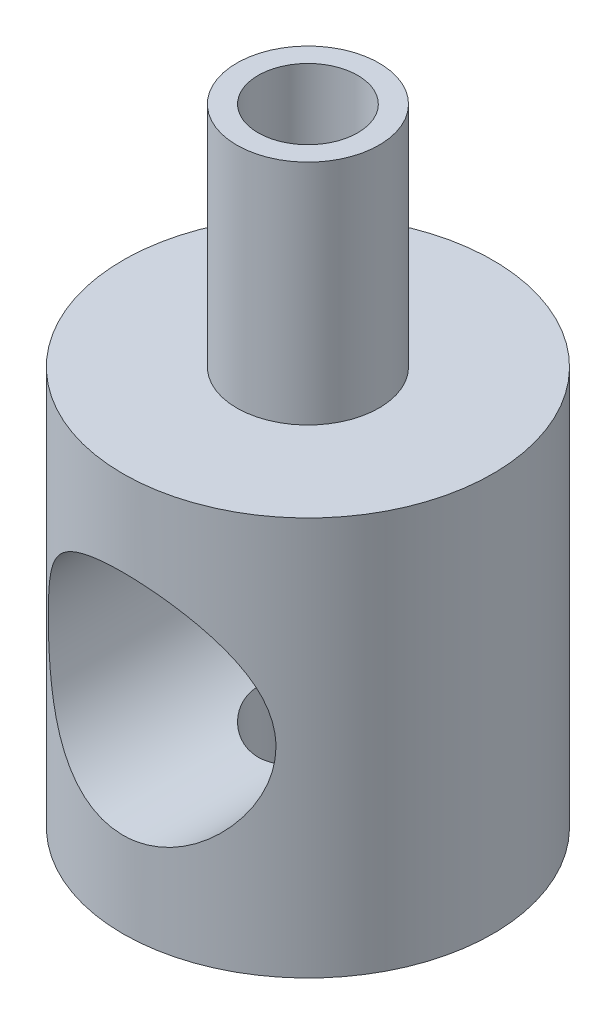
ISO-10303-21;
HEADER;
FILE_DESCRIPTION(('STEP AP214'),'2;1');
FILE_NAME('part.step','',(''),(''),'','','');
FILE_SCHEMA(('AUTOMOTIVE_DESIGN { 1 0 10303 214 1 1 1 1 }'));
ENDSEC;
DATA;
#1=APPLICATION_CONTEXT('core data for automotive mechanical design processes');
#2=APPLICATION_PROTOCOL_DEFINITION('international standard','automotive_design',2000,#1);
#3=PRODUCT_CONTEXT('',#1,'mechanical');
#4=PRODUCT('Part','Part','',(#3));
#5=PRODUCT_RELATED_PRODUCT_CATEGORY('part','',(#4));
#6=PRODUCT_DEFINITION_FORMATION('','',#4);
#7=PRODUCT_DEFINITION_CONTEXT('part definition',#1,'design');
#8=PRODUCT_DEFINITION('design','',#6,#7);
#9=PRODUCT_DEFINITION_SHAPE('','',#8);
#10=(LENGTH_UNIT() NAMED_UNIT(*) SI_UNIT(.MILLI.,.METRE.));
#11=(NAMED_UNIT(*) PLANE_ANGLE_UNIT() SI_UNIT($,.RADIAN.));
#12=(NAMED_UNIT(*) SI_UNIT($,.STERADIAN.) SOLID_ANGLE_UNIT());
#13=UNCERTAINTY_MEASURE_WITH_UNIT(LENGTH_MEASURE(1.E-05),#10,'distance_accuracy_value','');
#14=(GEOMETRIC_REPRESENTATION_CONTEXT(3) GLOBAL_UNCERTAINTY_ASSIGNED_CONTEXT((#13)) GLOBAL_UNIT_ASSIGNED_CONTEXT((#10,
#11,#12)) REPRESENTATION_CONTEXT('',''));
#15=CARTESIAN_POINT('',(0.,0.,0.));
#16=DIRECTION('',(0.,0.,1.));
#17=DIRECTION('',(1.,0.,0.));
#18=AXIS2_PLACEMENT_3D('',#15,#16,#17);
#19=CARTESIAN_POINT('',(0.,14.,0.));
#20=DIRECTION('',(0.,-1.,0.));
#21=DIRECTION('',(0.,0.,-1.));
#22=AXIS2_PLACEMENT_3D('',#19,#20,#21);
#23=CYLINDRICAL_SURFACE('',#22,6.5);
#24=CARTESIAN_POINT('',(0.,11.,-6.5));
#25=CARTESIAN_POINT('',(-0.101932680708924,10.9999993605496,-6.49999939964213));
#26=CARTESIAN_POINT('',(-0.203878806195381,10.9960978694263,-6.49759642537344));
#27=CARTESIAN_POINT('',(-0.406993632933588,10.9805452133556,-6.48804313805651));
#28=CARTESIAN_POINT('',(-0.508161926085146,10.9688902283073,-6.4808904848725));
#29=CARTESIAN_POINT('',(-0.709064124798982,10.9379650732709,-6.46199793989135));
#30=CARTESIAN_POINT('',(-0.808795470608417,10.9186827240797,-6.45025071191937));
#31=CARTESIAN_POINT('',(-1.00595451754588,10.8727665952846,-6.42246005549568));
#32=CARTESIAN_POINT('',(-1.10338121878899,10.8461296861396,-6.40641479821663));
#33=CARTESIAN_POINT('',(-1.3901756243653,10.7559736580001,-6.35255691803006));
#34=CARTESIAN_POINT('',(-1.57528943914544,10.6820146693303,-6.30889954357547));
#35=CARTESIAN_POINT('',(-1.9297608314987,10.5092732935954,-6.20967156345692));
#36=CARTESIAN_POINT('',(-2.09912096298403,10.4104949397713,-6.15410289363898));
#37=CARTESIAN_POINT('',(-2.43246843462129,10.18229876285,-6.03051332664323));
#38=CARTESIAN_POINT('',(-2.59498758730544,10.0510831217682,-5.96185703352483));
#39=CARTESIAN_POINT('',(-2.89713498384097,9.76583959083216,-5.8210369182389));
#40=CARTESIAN_POINT('',(-3.03673248524909,9.61178158311085,-5.74886855107056));
#41=CARTESIAN_POINT('',(-3.30759420144231,9.26164235327239,-5.59793127347747));
#42=CARTESIAN_POINT('',(-3.43539596724616,9.06270084680701,-5.51952937475281));
#43=CARTESIAN_POINT('',(-3.65533248103207,8.64156301331828,-5.37641343948428));
#44=CARTESIAN_POINT('',(-3.74752666836251,8.41940623405734,-5.31167667453346));
#45=CARTESIAN_POINT('',(-3.87326011357902,8.01520799199979,-5.22037402772382));
#46=CARTESIAN_POINT('',(-3.91573102482445,7.83719676588686,-5.18829771586181));
#47=CARTESIAN_POINT('',(-3.97594580589465,7.4748386947006,-5.14230907440785));
#48=CARTESIAN_POINT('',(-3.99372294201895,7.29050071666943,-5.12837230966469));
#49=CARTESIAN_POINT('',(-4.00349999950967,6.92027261804024,-5.12074595895237));
#50=CARTESIAN_POINT('',(-3.99543930608618,6.73437986950141,-5.1271039838178));
#51=CARTESIAN_POINT('',(-3.9539427145923,6.36710715457985,-5.15916479652258));
#52=CARTESIAN_POINT('',(-3.92048692916261,6.18573084012862,-5.18488274534039));
#53=CARTESIAN_POINT('',(-3.8309220569634,5.83546429640746,-5.25138392297175));
#54=CARTESIAN_POINT('',(-3.77525049357088,5.66640347782934,-5.29187495767105));
#55=CARTESIAN_POINT('',(-3.6433876025842,5.33963446047049,-5.38350835112645));
#56=CARTESIAN_POINT('',(-3.56718892487423,5.18193035385607,-5.43465452366339));
#57=CARTESIAN_POINT('',(-3.38044121046793,4.85178196605049,-5.55310061350775));
#58=CARTESIAN_POINT('',(-3.26616229358154,4.68189250530917,-5.62164554875382));
#59=CARTESIAN_POINT('',(-3.01364072965568,4.36189178554274,-5.76097603548284));
#60=CARTESIAN_POINT('',(-2.87537404935876,4.21180063041935,-5.83176377532338));
#61=CARTESIAN_POINT('',(-2.55329170194669,3.91192933309995,-5.98052624344214));
#62=CARTESIAN_POINT('',(-2.36573847303971,3.76579174015874,-6.05791793203029));
#63=CARTESIAN_POINT('',(-2.06484625711296,3.57207250182016,-6.16423657207204));
#64=CARTESIAN_POINT('',(-1.96123424376933,3.51172453695143,-6.19806179959712));
#65=CARTESIAN_POINT('',(-1.74801657559779,3.40015452810349,-6.26153122750258));
#66=CARTESIAN_POINT('',(-1.63841467671495,3.348926849164,-6.2911780071572));
#67=CARTESIAN_POINT('',(-1.42038496451484,3.25892916515688,-6.34384426018709));
#68=CARTESIAN_POINT('',(-1.31225072735403,3.21961295513676,-6.36714642141863));
#69=CARTESIAN_POINT('',(-1.09213710130066,3.15025472752427,-6.40856957345925));
#70=CARTESIAN_POINT('',(-0.980159948019933,3.12020741608496,-6.42669352131951));
#71=CARTESIAN_POINT('',(-0.753361043832851,3.06986909005646,-6.45720747876296));
#72=CARTESIAN_POINT('',(-0.638541739819373,3.0495699704636,-6.4696022514696));
#73=CARTESIAN_POINT('',(-0.407084361860792,3.01905776129522,-6.48827821016213));
#74=CARTESIAN_POINT('',(-0.290446579402582,3.00884307181541,-6.49456036591815));
#75=CARTESIAN_POINT('',(-0.0734077308498799,2.99941794828052,-6.50035751208076));
#76=CARTESIAN_POINT('',(0.0269142737033414,2.99883538840513,-6.50071629233339));
#77=CARTESIAN_POINT('',(0.227261420800576,3.00520346131638,-6.49679865155265));
#78=CARTESIAN_POINT('',(0.327286462827222,3.01215640528184,-6.49252080844237));
#79=CARTESIAN_POINT('',(0.52619632903519,3.0335009361582,-6.47943228783149));
#80=CARTESIAN_POINT('',(0.625081637761231,3.04788923305389,-6.4706236151527));
#81=CARTESIAN_POINT('',(0.821051746754855,3.08390269603218,-6.44869131450073));
#82=CARTESIAN_POINT('',(0.918135837974394,3.10553065077778,-6.43556602383216));
#83=CARTESIAN_POINT('',(1.19923146014627,3.17921110634348,-6.39115694243494));
#84=CARTESIAN_POINT('',(1.37996984617289,3.24083693385661,-6.35434768700243));
#85=CARTESIAN_POINT('',(1.72830568705178,3.38768945186722,-6.268592669914));
#86=CARTESIAN_POINT('',(1.89590079796368,3.47292033980892,-6.2196447499267));
#87=CARTESIAN_POINT('',(2.23192130281633,3.67423753059653,-6.1076166997366));
#88=CARTESIAN_POINT('',(2.39867686729207,3.79258871155709,-6.04360299577601));
#89=CARTESIAN_POINT('',(2.71116426769564,4.05196461619392,-5.91003761054415));
#90=CARTESIAN_POINT('',(2.856871799202,4.19301516018154,-5.84047966877912));
#91=CARTESIAN_POINT('',(3.14418734434135,4.51660740165099,-5.69155065108857));
#92=CARTESIAN_POINT('',(3.28237946774826,4.70219263707252,-5.61216608195678));
#93=CARTESIAN_POINT('',(3.52597700125825,5.09705953030064,-5.4624121106953));
#94=CARTESIAN_POINT('',(3.63141005068427,5.30632100761355,-5.3920351383684));
#95=CARTESIAN_POINT('',(3.78678713320714,5.69820052768224,-5.28367733942729));
#96=CARTESIAN_POINT('',(3.8437687122075,5.87698910865511,-5.24198866192205));
#97=CARTESIAN_POINT('',(3.93236674559127,6.24372442069239,-5.17586702804936));
#98=CARTESIAN_POINT('',(3.96402131570246,6.43165693672998,-5.15140814846112));
#99=CARTESIAN_POINT('',(4.00020927394428,6.81267671100441,-5.12336832701716));
#100=CARTESIAN_POINT('',(4.00460933438682,7.00578467580314,-5.11989002324805));
#101=CARTESIAN_POINT('',(3.9856031832953,7.38982111661236,-5.13469450762806));
#102=CARTESIAN_POINT('',(3.96218493014542,7.58074861264161,-5.15298671951048));
#103=CARTESIAN_POINT('',(3.89159080354568,7.94186813503688,-5.20646438912713));
#104=CARTESIAN_POINT('',(3.84612501709333,8.11258993932448,-5.24042638998554));
#105=CARTESIAN_POINT('',(3.73437644692224,8.44396977671975,-5.32063404638092));
#106=CARTESIAN_POINT('',(3.66808545804421,8.6046238131347,-5.3668845424927));
#107=CARTESIAN_POINT('',(3.50525660774396,8.93710246986113,-5.47485593522413));
#108=CARTESIAN_POINT('',(3.40568219493729,9.10701959386876,-5.53785535379418));
#109=CARTESIAN_POINT('',(3.18377799217514,9.42939028249621,-5.66834893374762));
#110=CARTESIAN_POINT('',(3.06142942967632,9.58182927130094,-5.73584677346185));
#111=CARTESIAN_POINT('',(2.77088545228835,9.89406092396146,-5.88245015568857));
#112=CARTESIAN_POINT('',(2.59839586958272,10.0500065855048,-5.96139567713425));
#113=CARTESIAN_POINT('',(2.31959905762348,10.2608412950503,-6.07285442111121));
#114=CARTESIAN_POINT('',(2.22322905085715,10.3273207146912,-6.10887614027553));
#115=CARTESIAN_POINT('',(2.02420708613854,10.4520071488549,-6.17767285816209));
#116=CARTESIAN_POINT('',(1.92155856623495,10.5102186338108,-6.21044960849657));
#117=CARTESIAN_POINT('',(1.71168075911793,10.6171633282273,-6.27152032206101));
#118=CARTESIAN_POINT('',(1.60451420044739,10.6659936587697,-6.29985958574469));
#119=CARTESIAN_POINT('',(1.38531879033559,10.7543094818501,-6.35165805839771));
#120=CARTESIAN_POINT('',(1.27329281083248,10.7938004073154,-6.37512010358107));
#121=CARTESIAN_POINT('',(1.04553758026327,10.8627670823621,-6.41640153061193));
#122=CARTESIAN_POINT('',(0.92981966812043,10.8922707715839,-6.43423664431957));
#123=CARTESIAN_POINT('',(0.695517286704317,10.9408818381719,-6.46375854143765));
#124=CARTESIAN_POINT('',(0.576935114015967,10.959997273648,-6.47545009014327));
#125=CARTESIAN_POINT('',(0.381732098443043,10.9824754948623,-6.48922704389008));
#126=CARTESIAN_POINT('',(0.30559913129093,10.9890415713301,-6.49326122029153));
#127=CARTESIAN_POINT('',(0.152979979894236,10.9978041889619,-6.49864800040319));
#128=CARTESIAN_POINT('',(0.0764937756709491,11.0000004798655,-6.50000045052911));
#129=CARTESIAN_POINT('',(0.,11.,-6.5));
#130=B_SPLINE_CURVE_WITH_KNOTS('',3,(#24,#25,#26,#27,#28,#29,#30,#31,#32,#33,#34,#35,#36,#37,
#38,#39,#40,#41,#42,#43,#44,#45,#46,#47,#48,#49,#50,#51,#52,#53,#54,#55,#56,#57,#58,#59,#60,#61,
#62,#63,#64,#65,#66,#67,#68,#69,#70,#71,#72,#73,#74,#75,#76,#77,#78,#79,#80,#81,#82,#83,#84,#85,
#86,#87,#88,#89,#90,#91,#92,#93,#94,#95,#96,#97,#98,#99,#100,#101,#102,#103,#104,#105,#106,#107,
#108,#109,#110,#111,#112,#113,#114,#115,#116,#117,#118,#119,#120,#121,#122,#123,#124,#125,#126,
#127,#128,#129),.UNSPECIFIED.,.T.,.F.,(4,2,2,2,2,2,2,2,2,2,2,2,2,2,2,2,2,2,2,2,2,2,2,2,2,2,2,2,
2,2,2,2,2,2,2,2,2,2,2,2,2,2,2,2,2,2,2,2,2,2,2,2,4),(0.,0.305718619840286,0.61158797711635,
0.917947724116181,1.22443803595933,1.83370758844798,2.44287819628248,3.09992173034146,
3.75783941554365,4.50157971065203,5.24407306607348,5.79913351601445,6.35344548688587,
6.90905880826944,7.46510769004447,8.01070711549894,8.55650216326685,9.20180749233863,
9.84776312419874,10.5936818084878,10.9669982233067,11.3400831783566,11.6917577434105,
12.0432310792623,12.3944116791819,12.7455365550122,13.0461288493385,13.346813363006,
13.6473649427503,13.9480324262314,14.5287938859811,15.1096586829247,15.7499604595229,
16.3909957894115,17.1215772639591,17.851540651547,18.4258989337247,18.9993912044513,
19.5756867690036,20.1522318835253,20.689865595597,21.2277114023502,21.8457728687646,
22.4643460724999,23.1972317489622,23.5643235343845,23.9312160731969,24.2940771063543,
24.6567265335618,25.0183528860118,25.379698325088,25.6091069128882,25.8385286386964),.UNSPECIFIED.);
#131=CARTESIAN_POINT('',(0.,11.,-6.5));
#132=VERTEX_POINT('',#131);
#133=EDGE_CURVE('E10',#132,#132,#130,.T.);
#134=ORIENTED_EDGE('',*,*,#133,.T.);
#135=EDGE_LOOP('',(#134));
#136=FACE_BOUND('',#135,.T.);
#137=CARTESIAN_POINT('',(4.,7.,5.1234753829798));
#138=CARTESIAN_POINT('',(3.99999887511368,6.90015669713617,5.12347713657617));
#139=CARTESIAN_POINT('',(3.99625399732967,6.80028579053627,5.12640682483417));
#140=CARTESIAN_POINT('',(3.98134025862972,6.60139163701732,5.13799719570292));
#141=CARTESIAN_POINT('',(3.9701665930275,6.50236898072765,5.1466615873077));
#142=CARTESIAN_POINT('',(3.9405590608807,6.30581741824697,5.16936573069827));
#143=CARTESIAN_POINT('',(3.9221093750139,6.20829225109523,5.18341719303693));
#144=CARTESIAN_POINT('',(3.87824609249434,6.01562931713894,5.21631619694594));
#145=CARTESIAN_POINT('',(3.85282903764331,5.92049276156711,5.2351661198617));
#146=CARTESIAN_POINT('',(3.76713981429484,5.64121496157163,5.2975118930577));
#147=CARTESIAN_POINT('',(3.69713461531885,5.46131227453469,5.34704541637303));
#148=CARTESIAN_POINT('',(3.53377707470374,5.11612784646797,5.45637608486704));
#149=CARTESIAN_POINT('',(3.44042543677516,4.9508456649488,5.51617292067096));
#150=CARTESIAN_POINT('',(3.21892377258575,4.61590906564967,5.64865193724251));
#151=CARTESIAN_POINT('',(3.08783223309545,4.44846262921534,5.72199980218117));
#152=CARTESIAN_POINT('',(2.80046904719545,4.1360126501527,5.86799191617871));
#153=CARTESIAN_POINT('',(2.64417611016677,3.99102828879258,5.94063551475959));
#154=CARTESIAN_POINT('',(2.38286990663015,3.78501097210863,6.0483243275859));
#155=CARTESIAN_POINT('',(2.28568158855732,3.71517412457287,6.08580938951634));
#156=CARTESIAN_POINT('',(2.08461055875056,3.58403886514078,6.15757848162021));
#157=CARTESIAN_POINT('',(1.98073067176673,3.52273688447564,6.19186384772521));
#158=CARTESIAN_POINT('',(1.76688192807704,3.40934971683696,6.2562444343275));
#159=CARTESIAN_POINT('',(1.65691599482346,3.3572601542414,6.28634164261803));
#160=CARTESIAN_POINT('',(1.43159946565469,3.26296530629451,6.34144803942563));
#161=CARTESIAN_POINT('',(1.31624981610916,3.22075829154191,6.3664581180667));
#162=CARTESIAN_POINT('',(1.09278967074767,3.1505670119568,6.40838703250716));
#163=CARTESIAN_POINT('',(0.985095920594981,3.12158728585046,6.42586235547201));
#164=CARTESIAN_POINT('',(0.766973793679368,3.0726294915698,6.45552932860006));
#165=CARTESIAN_POINT('',(0.656545856757167,3.05264998535452,6.46772182283343));
#166=CARTESIAN_POINT('',(0.43401467655262,3.02203123627441,6.48645425113834));
#167=CARTESIAN_POINT('',(0.321912828470645,3.01138461303053,6.49299865161972));
#168=CARTESIAN_POINT('',(0.0970285709890185,2.99959241139628,6.50024913730255));
#169=CARTESIAN_POINT('',(-0.0157537623365417,2.99844578996059,6.50095586344691));
#170=CARTESIAN_POINT('',(-0.226182592153618,3.00519983836845,6.49680097681437));
#171=CARTESIAN_POINT('',(-0.323882323128414,3.01193858094583,6.49265447843572));
#172=CARTESIAN_POINT('',(-0.518258298369309,3.03250994958416,6.48003989038484));
#173=CARTESIAN_POINT('',(-0.614934226051797,3.04634470808205,6.47157050163653));
#174=CARTESIAN_POINT('',(-0.902326020411394,3.09825697913932,6.43993788468158));
#175=CARTESIAN_POINT('',(-1.09060145777752,3.1467491941822,6.41054580962105));
#176=CARTESIAN_POINT('',(-1.45625882265054,3.26948498619312,6.33753263883013));
#177=CARTESIAN_POINT('',(-1.63359572328175,3.34382759576959,6.29385686120839));
#178=CARTESIAN_POINT('',(-1.9734742197741,3.51551091997735,6.19570063444803));
#179=CARTESIAN_POINT('',(-2.13601225543652,3.61285714849984,6.14121759534825));
#180=CARTESIAN_POINT('',(-2.46301792903409,3.84119316866455,6.01811329340775));
#181=CARTESIAN_POINT('',(-2.62527932595506,3.97484440634392,5.94857761116338));
#182=CARTESIAN_POINT('',(-2.92648326267955,4.26512674610548,5.80633337570436));
#183=CARTESIAN_POINT('',(-3.06539211925789,4.42179044126985,5.73362042679609));
#184=CARTESIAN_POINT('',(-3.33354274624901,4.77671769402503,5.58247201496418));
#185=CARTESIAN_POINT('',(-3.45941006662978,4.9777331220786,5.50445614718878));
#186=CARTESIAN_POINT('',(-3.67501039724317,5.40286838184919,5.36292828124607));
#187=CARTESIAN_POINT('',(-3.76481025437048,5.62694449543688,5.29938954688107));
#188=CARTESIAN_POINT('',(-3.88555185537444,6.03299890825635,5.2111969568149));
#189=CARTESIAN_POINT('',(-3.92569222311964,6.21097742366292,5.18074475085953));
#190=CARTESIAN_POINT('',(-3.98131827949251,6.5728050191953,5.13813041921935));
#191=CARTESIAN_POINT('',(-3.99683566482825,6.75664624069648,5.12594478044202));
#192=CARTESIAN_POINT('',(-4.00229325003938,7.12529980106099,5.12168600082458));
#193=CARTESIAN_POINT('',(-3.99218441424513,7.31011332541085,5.12965141888962));
#194=CARTESIAN_POINT('',(-3.9469473814774,7.6748670885276,5.16453073692964));
#195=CARTESIAN_POINT('',(-3.9117987593589,7.85480322430662,5.19146010573793));
#196=CARTESIAN_POINT('',(-3.81886572423089,8.20355272072869,5.26018225750345));
#197=CARTESIAN_POINT('',(-3.76131722200471,8.37246124927834,5.30181972845392));
#198=CARTESIAN_POINT('',(-3.62570220427766,8.69868577182605,5.39546702978721));
#199=CARTESIAN_POINT('',(-3.54762825488917,8.85599753923496,5.44748061653257));
#200=CARTESIAN_POINT('',(-3.35638015591539,9.18575033153292,5.56773730356902));
#201=CARTESIAN_POINT('',(-3.23937361019164,9.35552815453736,5.63719709708221));
#202=CARTESIAN_POINT('',(-2.98117533428057,9.67485662192666,5.7779144213707));
#203=CARTESIAN_POINT('',(-2.83995914704196,9.82438653536047,5.84917370734001));
#204=CARTESIAN_POINT('',(-2.51230294955814,10.1215519065965,5.99792993480129));
#205=CARTESIAN_POINT('',(-2.32226223380833,10.265621071129,6.07478576966285));
#206=CARTESIAN_POINT('',(-2.01780081268138,10.455842708803,6.17981341127997));
#207=CARTESIAN_POINT('',(-1.91302977376878,10.5149565958551,6.21312570303109));
#208=CARTESIAN_POINT('',(-1.69757398668656,10.6239187018636,6.27541066154967));
#209=CARTESIAN_POINT('',(-1.58689301876127,10.6737727545275,6.30438605831685));
#210=CARTESIAN_POINT('',(-1.36771717286115,10.7606297203576,6.35540596966367));
#211=CARTESIAN_POINT('',(-1.25954523414219,10.7982559662326,6.37777789582193));
#212=CARTESIAN_POINT('',(-1.0395424276752,10.864262936453,6.41730693921316));
#213=CARTESIAN_POINT('',(-0.927713693370161,10.8926489494385,6.43446703905276));
#214=CARTESIAN_POINT('',(-0.70140168691385,10.939718705732,6.46305144652246));
#215=CARTESIAN_POINT('',(-0.58692060325831,10.958410169835,6.47448031829465));
#216=CARTESIAN_POINT('',(-0.356332076611583,10.9857873594104,6.49125430740733));
#217=CARTESIAN_POINT('',(-0.24022488228897,10.9944745982013,6.49660034488408));
#218=CARTESIAN_POINT('',(-0.0241800032833927,11.0011719315121,6.50072100810798));
#219=CARTESIAN_POINT('',(0.0757032145151784,11.0005275597033,6.50032377647171));
#220=CARTESIAN_POINT('',(0.275051177742691,10.991779451216,6.49494349113715));
#221=CARTESIAN_POINT('',(0.374515785523161,10.9836734282492,6.48995903188888));
#222=CARTESIAN_POINT('',(0.572201216464005,10.9601119995884,6.47552310051639));
#223=CARTESIAN_POINT('',(0.670422543840657,10.9446596780852,6.46607350299796));
#224=CARTESIAN_POINT('',(0.86497787159693,10.9066170064448,6.44293674493903));
#225=CARTESIAN_POINT('',(0.961311128142406,10.8840239008214,6.42924794861747));
#226=CARTESIAN_POINT('',(1.24124770417762,10.8073556163928,6.38312478202401));
#227=CARTESIAN_POINT('',(1.42142818690046,10.7436901377319,6.34519014963781));
#228=CARTESIAN_POINT('',(1.76836086933044,10.5928789388212,6.25739870433962));
#229=CARTESIAN_POINT('',(1.93511056850881,10.5057288592986,6.20753967818403));
#230=CARTESIAN_POINT('',(2.26971440354609,10.3001387976256,6.09366985599603));
#231=CARTESIAN_POINT('',(2.43581096412528,10.1793609128653,6.02871907904727));
#232=CARTESIAN_POINT('',(2.74661627133291,9.91509953245222,5.89363170045023));
#233=CARTESIAN_POINT('',(2.89130002938076,9.77158990693547,5.82348918099979));
#234=CARTESIAN_POINT('',(3.17577814197269,9.4429428162594,5.67394446001722));
#235=CARTESIAN_POINT('',(3.31214609552205,9.25479387397566,5.59459938435396));
#236=CARTESIAN_POINT('',(3.55159996486829,8.85482777542316,5.44573530175625));
#237=CARTESIAN_POINT('',(3.65470839450382,8.64302676086278,5.37620966590185));
#238=CARTESIAN_POINT('',(3.80456746957854,8.2486922907222,5.27084090224943));
#239=CARTESIAN_POINT('',(3.85875009839216,8.07011304567992,5.23094618875543));
#240=CARTESIAN_POINT('',(3.92110216574551,7.7960769434388,5.18416897638833));
#241=CARTESIAN_POINT('',(3.9387240346589,7.70380262502461,5.17076120978012));
#242=CARTESIAN_POINT('',(3.96747159089492,7.51770085441489,5.1487383288086));
#243=CARTESIAN_POINT('',(3.97860091550645,7.4238743021785,5.1401205311106));
#244=CARTESIAN_POINT('',(3.99092178272306,7.27489069320054,5.13055281063194));
#245=CARTESIAN_POINT('',(3.99432349889887,7.22001116126915,5.12790291115791));
#246=CARTESIAN_POINT('',(3.99886315266007,7.11009057081354,5.12436353114302));
#247=CARTESIAN_POINT('',(4.00000062021594,7.05504948112632,5.12347441611906));
#248=CARTESIAN_POINT('',(4.,7.,5.1234753829798));
#249=B_SPLINE_CURVE_WITH_KNOTS('',3,(#137,#138,#139,#140,#141,#142,#143,#144,#145,#146,#147,
#148,#149,#150,#151,#152,#153,#154,#155,#156,#157,#158,#159,#160,#161,#162,#163,#164,#165,#166,
#167,#168,#169,#170,#171,#172,#173,#174,#175,#176,#177,#178,#179,#180,#181,#182,#183,#184,#185,
#186,#187,#188,#189,#190,#191,#192,#193,#194,#195,#196,#197,#198,#199,#200,#201,#202,#203,#204,
#205,#206,#207,#208,#209,#210,#211,#212,#213,#214,#215,#216,#217,#218,#219,#220,#221,#222,#223,
#224,#225,#226,#227,#228,#229,#230,#231,#232,#233,#234,#235,#236,#237,#238,#239,#240,#241,#242,
#243,#244,#245,#246,#247,#248),.UNSPECIFIED.,.T.,.F.,(4,2,2,2,2,2,2,2,2,2,2,2,2,2,2,2,2,2,2,2,2,
2,2,2,2,2,2,2,2,2,2,2,2,2,2,2,2,2,2,2,2,2,2,2,2,2,2,2,2,2,2,2,2,2,2,4),(0.,0.299465847023186,
0.599125566991792,0.89944042278291,1.19990460821029,1.79511322524675,2.39030390361143,
3.06260834820436,3.73548377320047,4.11128507027528,4.48692875482605,4.86239353791694,
5.23779256717747,5.5759578835789,5.91406914927767,6.25191279710496,6.58971935115932,
6.88341191371049,7.17719278611444,7.76417492115996,8.35343101568564,8.94282849646918,
9.60448206829833,10.2670819563898,11.0124413384164,11.7564128362636,12.3089912060134,
12.8608576731457,13.413780931277,13.9671557303272,14.5148536725638,15.0627502534703,
15.7129948273108,16.3639002039922,17.1112891013322,17.4853137026704,17.8591018628049,
18.2086733445076,18.5580443960154,18.9071367774896,19.2561763455443,19.5554587988362,
19.8548329843429,20.1540815946503,20.4534458203018,21.0352824358616,21.6172271279354,
22.2608757283334,22.9052696372282,23.6385367813605,24.3713065199459,24.9412520597774,
25.2256353387176,25.5098591455138,25.6749380032628,25.840051125734),.UNSPECIFIED.);
#250=CARTESIAN_POINT('',(4.,7.,5.1234753829798));
#251=VERTEX_POINT('',#250);
#252=EDGE_CURVE('E48',#251,#251,#249,.T.);
#253=ORIENTED_EDGE('',*,*,#252,.T.);
#254=EDGE_LOOP('',(#253));
#255=FACE_BOUND('',#254,.T.);
#256=CARTESIAN_POINT('',(0.,14.,0.));
#257=DIRECTION('',(0.,1.,0.));
#258=DIRECTION('',(0.,0.,1.));
#259=AXIS2_PLACEMENT_3D('',#256,#257,#258);
#260=CIRCLE('',#259,6.5);
#261=CARTESIAN_POINT('',(0.,14.,6.5));
#262=VERTEX_POINT('',#261);
#263=EDGE_CURVE('E104',#262,#262,#260,.T.);
#264=ORIENTED_EDGE('',*,*,#263,.F.);
#265=EDGE_LOOP('',(#264));
#266=FACE_BOUND('',#265,.T.);
#267=CARTESIAN_POINT('',(0.,0.,0.));
#268=DIRECTION('',(0.,1.,0.));
#269=DIRECTION('',(0.,0.,1.));
#270=AXIS2_PLACEMENT_3D('',#267,#268,#269);
#271=CIRCLE('',#270,6.5);
#272=CARTESIAN_POINT('',(0.,0.,6.5));
#273=VERTEX_POINT('',#272);
#274=EDGE_CURVE('E107',#273,#273,#271,.T.);
#275=ORIENTED_EDGE('',*,*,#274,.T.);
#276=EDGE_LOOP('',(#275));
#277=FACE_BOUND('',#276,.T.);
#278=ADVANCED_FACE('F35',(#136,#255,#266,#277),#23,.T.);
#279=CARTESIAN_POINT('',(0.,14.,0.));
#280=DIRECTION('',(0.,1.,0.));
#281=DIRECTION('',(0.,0.,1.));
#282=AXIS2_PLACEMENT_3D('',#279,#280,#281);
#283=PLANE('',#282);
#284=CARTESIAN_POINT('',(0.,14.,0.));
#285=DIRECTION('',(0.,1.,0.));
#286=DIRECTION('',(0.,0.,1.));
#287=AXIS2_PLACEMENT_3D('',#284,#285,#286);
#288=CIRCLE('',#287,2.5);
#289=CARTESIAN_POINT('',(0.,14.,2.5));
#290=VERTEX_POINT('',#289);
#291=EDGE_CURVE('E53',#290,#290,#288,.T.);
#292=ORIENTED_EDGE('',*,*,#291,.F.);
#293=EDGE_LOOP('',(#292));
#294=FACE_BOUND('',#293,.T.);
#295=ORIENTED_EDGE('',*,*,#263,.T.);
#296=EDGE_LOOP('',(#295));
#297=FACE_BOUND('',#296,.T.);
#298=ADVANCED_FACE('F86',(#294,#297),#283,.T.);
#299=CARTESIAN_POINT('',(0.,0.,0.));
#300=DIRECTION('',(0.,1.,0.));
#301=DIRECTION('',(0.,0.,1.));
#302=AXIS2_PLACEMENT_3D('',#299,#300,#301);
#303=PLANE('',#302);
#304=CARTESIAN_POINT('',(0.,0.,0.));
#305=DIRECTION('',(0.,1.,0.));
#306=DIRECTION('',(0.,0.,1.));
#307=AXIS2_PLACEMENT_3D('',#304,#305,#306);
#308=CIRCLE('',#307,1.75);
#309=CARTESIAN_POINT('',(0.,0.,1.75));
#310=VERTEX_POINT('',#309);
#311=EDGE_CURVE('E118',#310,#310,#308,.T.);
#312=ORIENTED_EDGE('',*,*,#311,.T.);
#313=EDGE_LOOP('',(#312));
#314=FACE_BOUND('',#313,.T.);
#315=ORIENTED_EDGE('',*,*,#274,.F.);
#316=EDGE_LOOP('',(#315));
#317=FACE_BOUND('',#316,.T.);
#318=ADVANCED_FACE('F84',(#314,#317),#303,.F.);
#319=CARTESIAN_POINT('',(0.,22.,0.));
#320=DIRECTION('',(0.,-1.,0.));
#321=DIRECTION('',(0.,0.,-1.));
#322=AXIS2_PLACEMENT_3D('',#319,#320,#321);
#323=CYLINDRICAL_SURFACE('',#322,2.5);
#324=CARTESIAN_POINT('',(0.,22.,0.));
#325=DIRECTION('',(0.,1.,0.));
#326=DIRECTION('',(0.,0.,1.));
#327=AXIS2_PLACEMENT_3D('',#324,#325,#326);
#328=CIRCLE('',#327,2.5);
#329=CARTESIAN_POINT('',(0.,22.,2.5));
#330=VERTEX_POINT('',#329);
#331=EDGE_CURVE('E108',#330,#330,#328,.T.);
#332=ORIENTED_EDGE('',*,*,#331,.F.);
#333=EDGE_LOOP('',(#332));
#334=FACE_BOUND('',#333,.T.);
#335=ORIENTED_EDGE('',*,*,#291,.T.);
#336=EDGE_LOOP('',(#335));
#337=FACE_BOUND('',#336,.T.);
#338=ADVANCED_FACE('F80',(#334,#337),#323,.T.);
#339=CARTESIAN_POINT('',(0.,22.,0.));
#340=DIRECTION('',(0.,1.,0.));
#341=DIRECTION('',(0.,0.,1.));
#342=AXIS2_PLACEMENT_3D('',#339,#340,#341);
#343=PLANE('',#342);
#344=CARTESIAN_POINT('',(0.,22.,0.));
#345=DIRECTION('',(0.,1.,0.));
#346=DIRECTION('',(0.,0.,1.));
#347=AXIS2_PLACEMENT_3D('',#344,#345,#346);
#348=CIRCLE('',#347,1.75);
#349=CARTESIAN_POINT('',(0.,22.,1.75));
#350=VERTEX_POINT('',#349);
#351=EDGE_CURVE('E115',#350,#350,#348,.T.);
#352=ORIENTED_EDGE('',*,*,#351,.F.);
#353=EDGE_LOOP('',(#352));
#354=FACE_BOUND('',#353,.T.);
#355=ORIENTED_EDGE('',*,*,#331,.T.);
#356=EDGE_LOOP('',(#355));
#357=FACE_BOUND('',#356,.T.);
#358=ADVANCED_FACE('F71',(#354,#357),#343,.T.);
#359=CARTESIAN_POINT('',(0.,7.,-6.5));
#360=DIRECTION('',(0.,0.,1.));
#361=DIRECTION('',(1.,0.,0.));
#362=AXIS2_PLACEMENT_3D('',#359,#360,#361);
#363=CYLINDRICAL_SURFACE('',#362,4.);
#364=CARTESIAN_POINT('',(0.,3.,1.75));
#365=CARTESIAN_POINT('',(-0.0933208021376279,3.00000333558042,1.74999588904635));
#366=CARTESIAN_POINT('',(-0.186791477069386,3.00330243202462,1.74249140970769));
#367=CARTESIAN_POINT('',(-0.371052098047161,3.01617059729483,1.71276700289617));
#368=CARTESIAN_POINT('',(-0.461834882194289,3.02575507359091,1.69051091308275));
#369=CARTESIAN_POINT('',(-0.637762370983102,3.05017488782027,1.63227195775906));
#370=CARTESIAN_POINT('',(-0.722925716756372,3.06499170912675,1.59633746394681));
#371=CARTESIAN_POINT('',(-0.885924397797227,3.09845284193832,1.51197418470805));
#372=CARTESIAN_POINT('',(-0.963761534990773,3.1170962086741,1.46354848258912));
#373=CARTESIAN_POINT('',(-1.11424905399244,3.15749853698736,1.35281306786408));
#374=CARTESIAN_POINT('',(-1.18645114152034,3.17936612119006,1.28993416744918));
#375=CARTESIAN_POINT('',(-1.31967793400787,3.22331085896425,1.15328441969583));
#376=CARTESIAN_POINT('',(-1.38069618036177,3.2453881259349,1.07950732284131));
#377=CARTESIAN_POINT('',(-1.49318376396214,3.28863402560614,0.918201796237513));
#378=CARTESIAN_POINT('',(-1.5439348600549,3.30968415866084,0.830137308618017));
#379=CARTESIAN_POINT('',(-1.62970389371015,3.34674606618668,0.645673342042772));
#380=CARTESIAN_POINT('',(-1.66473074488337,3.36276069359097,0.549278622303178));
#381=CARTESIAN_POINT('',(-1.71615853266316,3.38675043225012,0.356047878420053));
#382=CARTESIAN_POINT('',(-1.73342638146773,3.39509734953472,0.259490643332212));
#383=CARTESIAN_POINT('',(-1.7515441163367,3.40386240511102,0.0645165274543548));
#384=CARTESIAN_POINT('',(-1.75240445346846,3.40428559056682,-0.03389912958175));
#385=CARTESIAN_POINT('',(-1.73833087119091,3.39746668731616,-0.220729498627545));
#386=CARTESIAN_POINT('',(-1.72475146252694,3.39088192832314,-0.309275270322114));
#387=CARTESIAN_POINT('',(-1.68447345749386,3.37190966896119,-0.48267513603623));
#388=CARTESIAN_POINT('',(-1.65777203045127,3.35952091658543,-0.567528429215522));
#389=CARTESIAN_POINT('',(-1.59147949646595,3.3300505905026,-0.733382240836769));
#390=CARTESIAN_POINT('',(-1.55161548380299,3.31287097214852,-0.814255464336524));
#391=CARTESIAN_POINT('',(-1.46032468612094,3.27577176959665,-0.968499824169104));
#392=CARTESIAN_POINT('',(-1.40889310262634,3.25585104966646,-1.04186782874934));
#393=CARTESIAN_POINT('',(-1.29025562961713,3.21323753104461,-1.1862852496265));
#394=CARTESIAN_POINT('',(-1.22202090112491,3.19046025689731,-1.25646710827115));
#395=CARTESIAN_POINT('',(-1.07454982739095,3.14626610266463,-1.38469984782768));
#396=CARTESIAN_POINT('',(-0.995310366808165,3.12484961031547,-1.44274728189415));
#397=CARTESIAN_POINT('',(-0.825211565354428,3.08504737453244,-1.54651800476544));
#398=CARTESIAN_POINT('',(-0.734090347829088,3.06676248625666,-1.59185364112172));
#399=CARTESIAN_POINT('',(-0.544509238570125,3.03607453394806,-1.66624137231555));
#400=CARTESIAN_POINT('',(-0.446053869838119,3.02366787897165,-1.69530341048153));
#401=CARTESIAN_POINT('',(-0.251818809338713,3.00682645843175,-1.73442287512042));
#402=CARTESIAN_POINT('',(-0.156315416886936,3.00190522570002,-1.74564241675052));
#403=CARTESIAN_POINT('',(0.035330081417649,2.99900966688349,-1.75226589444033));
#404=CARTESIAN_POINT('',(0.131471969024797,3.00103307786471,-1.74767498238446));
#405=CARTESIAN_POINT('',(0.315992161297288,3.0114890789097,-1.72360770202349));
#406=CARTESIAN_POINT('',(0.404504007730724,3.01955703444733,-1.70497786612351));
#407=CARTESIAN_POINT('',(0.577030142651311,3.04088436865451,-1.65457429339422));
#408=CARTESIAN_POINT('',(0.661043877207288,3.05414438504939,-1.62279894191332));
#409=CARTESIAN_POINT('',(0.825165661686956,3.08511849020047,-1.54598460521644));
#410=CARTESIAN_POINT('',(0.905069644588076,3.10295880749209,-1.50056219936479));
#411=CARTESIAN_POINT('',(1.0564097961171,3.14123056999407,-1.39816138359301));
#412=CARTESIAN_POINT('',(1.1278422828707,3.16166313391738,-1.34117797799466));
#413=CARTESIAN_POINT('',(1.26610541024866,3.20492056787464,-1.21206799623628));
#414=CARTESIAN_POINT('',(1.33213752710984,3.22780747265567,-1.13910496858051));
#415=CARTESIAN_POINT('',(1.45127723569568,3.2720190445073,-0.982828644863169));
#416=CARTESIAN_POINT('',(1.50438069313657,3.29334321033072,-0.899512050803089));
#417=CARTESIAN_POINT('',(1.59708463750426,3.33231517030612,-0.722498058973699));
#418=CARTESIAN_POINT('',(1.63637850764007,3.3498764625308,-0.628619566303336));
#419=CARTESIAN_POINT('',(1.69823507183314,3.37823573341692,-0.434560717177654));
#420=CARTESIAN_POINT('',(1.72081348143927,3.3890400633542,-0.334386376356474));
#421=CARTESIAN_POINT('',(1.74696403021432,3.40162425568644,-0.139523617977322));
#422=CARTESIAN_POINT('',(1.75195667985798,3.4040780224944,-0.045068899334389));
#423=CARTESIAN_POINT('',(1.74666465122515,3.40150408714995,0.14329712181326));
#424=CARTESIAN_POINT('',(1.73638296890185,3.39647785214714,0.237208527258262));
#425=CARTESIAN_POINT('',(1.70206577064757,3.3801522127065,0.416318138785753));
#426=CARTESIAN_POINT('',(1.67884052166308,3.36922344954246,0.501708806876238));
#427=CARTESIAN_POINT('',(1.62013408778852,3.34265151553604,0.667379097899793));
#428=CARTESIAN_POINT('',(1.58464938638235,3.32700699218369,0.747657246518184));
#429=CARTESIAN_POINT('',(1.49986081699045,3.29154302521548,0.906376435380403));
#430=CARTESIAN_POINT('',(1.44982524386748,3.27152219855874,0.984380632580745));
#431=CARTESIAN_POINT('',(1.33832421624399,3.23006312993544,1.13132789960859));
#432=CARTESIAN_POINT('',(1.2768541815208,3.20862432220355,1.20026731946692));
#433=CARTESIAN_POINT('',(1.13814292885617,3.16459249079224,1.33307983027064));
#434=CARTESIAN_POINT('',(1.06001251187605,3.14205296011921,1.39604653411212));
#435=CARTESIAN_POINT('',(0.89349033924875,3.10012346582465,1.50805859579016));
#436=CARTESIAN_POINT('',(0.80509394686816,3.08073493494484,1.55709762832748));
#437=CARTESIAN_POINT('',(0.621505913098663,3.04749180330337,1.63896470522492));
#438=CARTESIAN_POINT('',(0.526416031150766,3.03356937953852,1.67199270647407));
#439=CARTESIAN_POINT('',(0.331430098304017,3.01255732633428,1.7212506249715));
#440=CARTESIAN_POINT('',(0.231549809572732,3.00544671251826,1.73753214272102));
#441=CARTESIAN_POINT('',(0.109273272177695,3.00143241542413,1.74672306547471));
#442=CARTESIAN_POINT('',(0.0874424410112461,3.00089614364349,1.74795081762372));
#443=CARTESIAN_POINT('',(0.0437438187013895,3.00017954334666,1.74958977045524));
#444=CARTESIAN_POINT('',(0.0218760272222168,2.99999921808165,1.75000096367939));
#445=CARTESIAN_POINT('',(0.,3.,1.75));
#446=B_SPLINE_CURVE_WITH_KNOTS('',3,(#364,#365,#366,#367,#368,#369,#370,#371,#372,#373,#374,
#375,#376,#377,#378,#379,#380,#381,#382,#383,#384,#385,#386,#387,#388,#389,#390,#391,#392,#393,
#394,#395,#396,#397,#398,#399,#400,#401,#402,#403,#404,#405,#406,#407,#408,#409,#410,#411,#412,
#413,#414,#415,#416,#417,#418,#419,#420,#421,#422,#423,#424,#425,#426,#427,#428,#429,#430,#431,
#432,#433,#434,#435,#436,#437,#438,#439,#440,#441,#442,#443,#444,#445),.UNSPECIFIED.,.T.,.F.,(4,
2,2,2,2,2,2,2,2,2,2,2,2,2,2,2,2,2,2,2,2,2,2,2,2,2,2,2,2,2,2,2,2,2,2,2,2,2,2,2,4),(0.,
0.279872304851462,0.560433243383634,0.84001110011875,1.11952001228341,1.41288259073525,
1.70641405428781,2.01624236279268,2.32589481629947,2.61958825885352,2.91309462169679,
3.18131126909427,3.4495858014316,3.72381406538429,3.99815629557733,4.29830934471343,
4.59854753835201,4.90713582543981,5.21553535573486,5.50287793843212,5.79012689853542,
6.06131696900678,6.33254035939979,6.6122385836566,6.89205792804337,7.19379163722775,
7.49562170745567,7.80378322147106,8.11165463883636,8.39400233075724,8.67629464946811,
8.94263075918958,9.20904332859725,9.49229511970285,9.77566061628732,10.0827330050938,
10.3899446296772,10.6932138626604,10.9955458150424,11.0611521760902,11.1267591363759),.UNSPECIFIED.);
#447=CARTESIAN_POINT('',(0.,3.,1.75));
#448=VERTEX_POINT('',#447);
#449=EDGE_CURVE('E39',#448,#448,#446,.T.);
#450=ORIENTED_EDGE('',*,*,#449,.T.);
#451=EDGE_LOOP('',(#450));
#452=FACE_BOUND('',#451,.T.);
#453=CARTESIAN_POINT('',(0.,11.,1.75));
#454=CARTESIAN_POINT('',(0.0933208021376279,10.9999966644196,1.74999588904635));
#455=CARTESIAN_POINT('',(0.186791477069386,10.9966975679754,1.74249140970769));
#456=CARTESIAN_POINT('',(0.371052098047161,10.9838294027052,1.71276700289617));
#457=CARTESIAN_POINT('',(0.461834882194289,10.9742449264091,1.69051091308275));
#458=CARTESIAN_POINT('',(0.637762370983102,10.9498251121797,1.63227195775906));
#459=CARTESIAN_POINT('',(0.722925716756371,10.9350082908733,1.59633746394681));
#460=CARTESIAN_POINT('',(0.885924397797226,10.9015471580617,1.51197418470805));
#461=CARTESIAN_POINT('',(0.963761534990772,10.8829037913259,1.46354848258912));
#462=CARTESIAN_POINT('',(1.11424905399244,10.8425014630126,1.35281306786408));
#463=CARTESIAN_POINT('',(1.18645114152034,10.8206338788099,1.28993416744918));
#464=CARTESIAN_POINT('',(1.31967793400786,10.7766891410358,1.15328441969583));
#465=CARTESIAN_POINT('',(1.38069618036177,10.7546118740651,1.07950732284131));
#466=CARTESIAN_POINT('',(1.49318376396214,10.7113659743939,0.918201796237513));
#467=CARTESIAN_POINT('',(1.54393486005489,10.6903158413392,0.830137308618017));
#468=CARTESIAN_POINT('',(1.62970389371015,10.6532539338133,0.645673342042772));
#469=CARTESIAN_POINT('',(1.66473074488337,10.637239306409,0.549278622303178));
#470=CARTESIAN_POINT('',(1.71615853266316,10.6132495677499,0.356047878420053));
#471=CARTESIAN_POINT('',(1.73342638146773,10.6049026504653,0.259490643332212));
#472=CARTESIAN_POINT('',(1.7515441163367,10.596137594889,0.0645165274543557));
#473=CARTESIAN_POINT('',(1.75240445346846,10.5957144094332,-0.0338991295817491));
#474=CARTESIAN_POINT('',(1.73833087119091,10.6025333126838,-0.220729498627544));
#475=CARTESIAN_POINT('',(1.72475146252694,10.6091180716769,-0.309275270322113));
#476=CARTESIAN_POINT('',(1.68447345749386,10.6280903310388,-0.482675136036229));
#477=CARTESIAN_POINT('',(1.65777203045127,10.6404790834146,-0.567528429215521));
#478=CARTESIAN_POINT('',(1.59147949646595,10.6699494094974,-0.733382240836769));
#479=CARTESIAN_POINT('',(1.55161548380299,10.6871290278515,-0.814255464336523));
#480=CARTESIAN_POINT('',(1.46032468612094,10.7242282304033,-0.968499824169104));
#481=CARTESIAN_POINT('',(1.40889310262634,10.7441489503335,-1.04186782874934));
#482=CARTESIAN_POINT('',(1.29025562961713,10.7867624689554,-1.1862852496265));
#483=CARTESIAN_POINT('',(1.22202090112491,10.8095397431027,-1.25646710827115));
#484=CARTESIAN_POINT('',(1.07454982739095,10.8537338973354,-1.38469984782768));
#485=CARTESIAN_POINT('',(0.995310366808165,10.8751503896845,-1.44274728189415));
#486=CARTESIAN_POINT('',(0.825211565354429,10.9149526254676,-1.54651800476544));
#487=CARTESIAN_POINT('',(0.734090347829089,10.9332375137433,-1.59185364112172));
#488=CARTESIAN_POINT('',(0.544509238570126,10.9639254660519,-1.66624137231555));
#489=CARTESIAN_POINT('',(0.44605386983812,10.9763321210284,-1.69530341048153));
#490=CARTESIAN_POINT('',(0.251818809338714,10.9931735415682,-1.73442287512042));
#491=CARTESIAN_POINT('',(0.156315416886936,10.9980947743,-1.74564241675052));
#492=CARTESIAN_POINT('',(-0.0353300814176486,11.0009903331165,-1.75226589444033));
#493=CARTESIAN_POINT('',(-0.131471969024797,10.9989669221353,-1.74767498238446));
#494=CARTESIAN_POINT('',(-0.315992161297287,10.9885109210903,-1.72360770202349));
#495=CARTESIAN_POINT('',(-0.404504007730723,10.9804429655527,-1.70497786612351));
#496=CARTESIAN_POINT('',(-0.577030142651311,10.9591156313455,-1.65457429339422));
#497=CARTESIAN_POINT('',(-0.661043877207287,10.9458556149506,-1.62279894191332));
#498=CARTESIAN_POINT('',(-0.825165661686955,10.9148815097995,-1.54598460521645));
#499=CARTESIAN_POINT('',(-0.905069644588075,10.8970411925079,-1.50056219936479));
#500=CARTESIAN_POINT('',(-1.0564097961171,10.8587694300059,-1.39816138359301));
#501=CARTESIAN_POINT('',(-1.1278422828707,10.8383368660826,-1.34117797799467));
#502=CARTESIAN_POINT('',(-1.26610541024866,10.7950794321254,-1.21206799623628));
#503=CARTESIAN_POINT('',(-1.33213752710984,10.7721925273443,-1.13910496858051));
#504=CARTESIAN_POINT('',(-1.45127723569568,10.7279809554927,-0.982828644863169));
#505=CARTESIAN_POINT('',(-1.50438069313657,10.7066567896693,-0.899512050803089));
#506=CARTESIAN_POINT('',(-1.59708463750426,10.6676848296939,-0.7224980589737));
#507=CARTESIAN_POINT('',(-1.63637850764007,10.6501235374692,-0.628619566303337));
#508=CARTESIAN_POINT('',(-1.69823507183314,10.6217642665831,-0.434560717177656));
#509=CARTESIAN_POINT('',(-1.72081348143927,10.6109599366458,-0.334386376356476));
#510=CARTESIAN_POINT('',(-1.74696403021432,10.5983757443136,-0.139523617977323));
#511=CARTESIAN_POINT('',(-1.75195667985798,10.5959219775056,-0.0450688993343898));
#512=CARTESIAN_POINT('',(-1.74666465122515,10.5984959128501,0.143297121813259));
#513=CARTESIAN_POINT('',(-1.73638296890185,10.6035221478529,0.237208527258261));
#514=CARTESIAN_POINT('',(-1.70206577064757,10.6198477872935,0.416318138785752));
#515=CARTESIAN_POINT('',(-1.67884052166308,10.6307765504575,0.501708806876236));
#516=CARTESIAN_POINT('',(-1.62013408778852,10.657348484464,0.667379097899791));
#517=CARTESIAN_POINT('',(-1.58464938638235,10.6729930078163,0.747657246518183));
#518=CARTESIAN_POINT('',(-1.49986081699045,10.7084569747845,0.906376435380403));
#519=CARTESIAN_POINT('',(-1.44982524386748,10.7284778014413,0.984380632580745));
#520=CARTESIAN_POINT('',(-1.33832421624399,10.7699368700646,1.13132789960859));
#521=CARTESIAN_POINT('',(-1.2768541815208,10.7913756777964,1.20026731946692));
#522=CARTESIAN_POINT('',(-1.13814292885617,10.8354075092078,1.33307983027064));
#523=CARTESIAN_POINT('',(-1.06001251187605,10.8579470398808,1.39604653411212));
#524=CARTESIAN_POINT('',(-0.893490339248751,10.8998765341753,1.50805859579016));
#525=CARTESIAN_POINT('',(-0.80509394686816,10.9192650650552,1.55709762832748));
#526=CARTESIAN_POINT('',(-0.621505913098663,10.9525081966966,1.63896470522492));
#527=CARTESIAN_POINT('',(-0.526416031150767,10.9664306204615,1.67199270647407));
#528=CARTESIAN_POINT('',(-0.331430098304018,10.9874426736657,1.7212506249715));
#529=CARTESIAN_POINT('',(-0.231549809572733,10.9945532874817,1.73753214272102));
#530=CARTESIAN_POINT('',(-0.109273272177696,10.9985675845759,1.74672306547471));
#531=CARTESIAN_POINT('',(-0.0874424410112467,10.9991038563565,1.74795081762372));
#532=CARTESIAN_POINT('',(-0.0437438187013898,10.9998204566533,1.74958977045524));
#533=CARTESIAN_POINT('',(-0.021876027222217,11.0000007819184,1.75000096367939));
#534=CARTESIAN_POINT('',(0.,11.,1.75));
#535=B_SPLINE_CURVE_WITH_KNOTS('',3,(#453,#454,#455,#456,#457,#458,#459,#460,#461,#462,#463,
#464,#465,#466,#467,#468,#469,#470,#471,#472,#473,#474,#475,#476,#477,#478,#479,#480,#481,#482,
#483,#484,#485,#486,#487,#488,#489,#490,#491,#492,#493,#494,#495,#496,#497,#498,#499,#500,#501,
#502,#503,#504,#505,#506,#507,#508,#509,#510,#511,#512,#513,#514,#515,#516,#517,#518,#519,#520,
#521,#522,#523,#524,#525,#526,#527,#528,#529,#530,#531,#532,#533,#534),.UNSPECIFIED.,.T.,.F.,(4,
2,2,2,2,2,2,2,2,2,2,2,2,2,2,2,2,2,2,2,2,2,2,2,2,2,2,2,2,2,2,2,2,2,2,2,2,2,2,2,4),(0.,
0.279872304851462,0.560433243383633,0.84001110011875,1.11952001228341,1.41288259073525,
1.7064140542878,2.01624236279268,2.32589481629947,2.61958825885352,2.91309462169679,
3.18131126909427,3.4495858014316,3.72381406538429,3.99815629557733,4.29830934471343,
4.59854753835201,4.90713582543981,5.21553535573486,5.50287793843212,5.79012689853542,
6.06131696900678,6.33254035939979,6.6122385836566,6.89205792804337,7.19379163722775,
7.49562170745567,7.80378322147106,8.11165463883636,8.39400233075725,8.67629464946811,
8.94263075918958,9.20904332859725,9.49229511970286,9.77566061628732,10.0827330050938,
10.3899446296772,10.6932138626604,10.9955458150424,11.0611521760902,11.1267591363759),.UNSPECIFIED.);
#536=CARTESIAN_POINT('',(0.,11.,1.75));
#537=VERTEX_POINT('',#536);
#538=EDGE_CURVE('E62',#537,#537,#535,.T.);
#539=ORIENTED_EDGE('',*,*,#538,.T.);
#540=EDGE_LOOP('',(#539));
#541=FACE_BOUND('',#540,.T.);
#542=ORIENTED_EDGE('',*,*,#252,.F.);
#543=EDGE_LOOP('',(#542));
#544=FACE_BOUND('',#543,.T.);
#545=ORIENTED_EDGE('',*,*,#133,.F.);
#546=EDGE_LOOP('',(#545));
#547=FACE_BOUND('',#546,.T.);
#548=ADVANCED_FACE('F66',(#452,#541,#544,#547),#363,.F.);
#549=CARTESIAN_POINT('',(0.,0.,0.));
#550=DIRECTION('',(0.,1.,0.));
#551=DIRECTION('',(0.,0.,1.));
#552=AXIS2_PLACEMENT_3D('',#549,#550,#551);
#553=CYLINDRICAL_SURFACE('',#552,1.75);
#554=ORIENTED_EDGE('',*,*,#351,.T.);
#555=EDGE_LOOP('',(#554));
#556=FACE_BOUND('',#555,.T.);
#557=ORIENTED_EDGE('',*,*,#538,.F.);
#558=EDGE_LOOP('',(#557));
#559=FACE_BOUND('',#558,.T.);
#560=ADVANCED_FACE('F70',(#556,#559),#553,.F.);
#561=ORIENTED_EDGE('',*,*,#311,.F.);
#562=EDGE_LOOP('',(#561));
#563=FACE_BOUND('',#562,.T.);
#564=ORIENTED_EDGE('',*,*,#449,.F.);
#565=EDGE_LOOP('',(#564));
#566=FACE_BOUND('',#565,.T.);
#567=ADVANCED_FACE('F73',(#563,#566),#553,.F.);
#568=CLOSED_SHELL('',(#278,#298,#318,#338,#358,#548,#560,#567));
#569=MANIFOLD_SOLID_BREP('B2',#568);
#570=ADVANCED_BREP_SHAPE_REPRESENTATION('',(#18,#569),#14);
#571=SHAPE_DEFINITION_REPRESENTATION(#9,#570);
ENDSEC;
END-ISO-10303-21;
